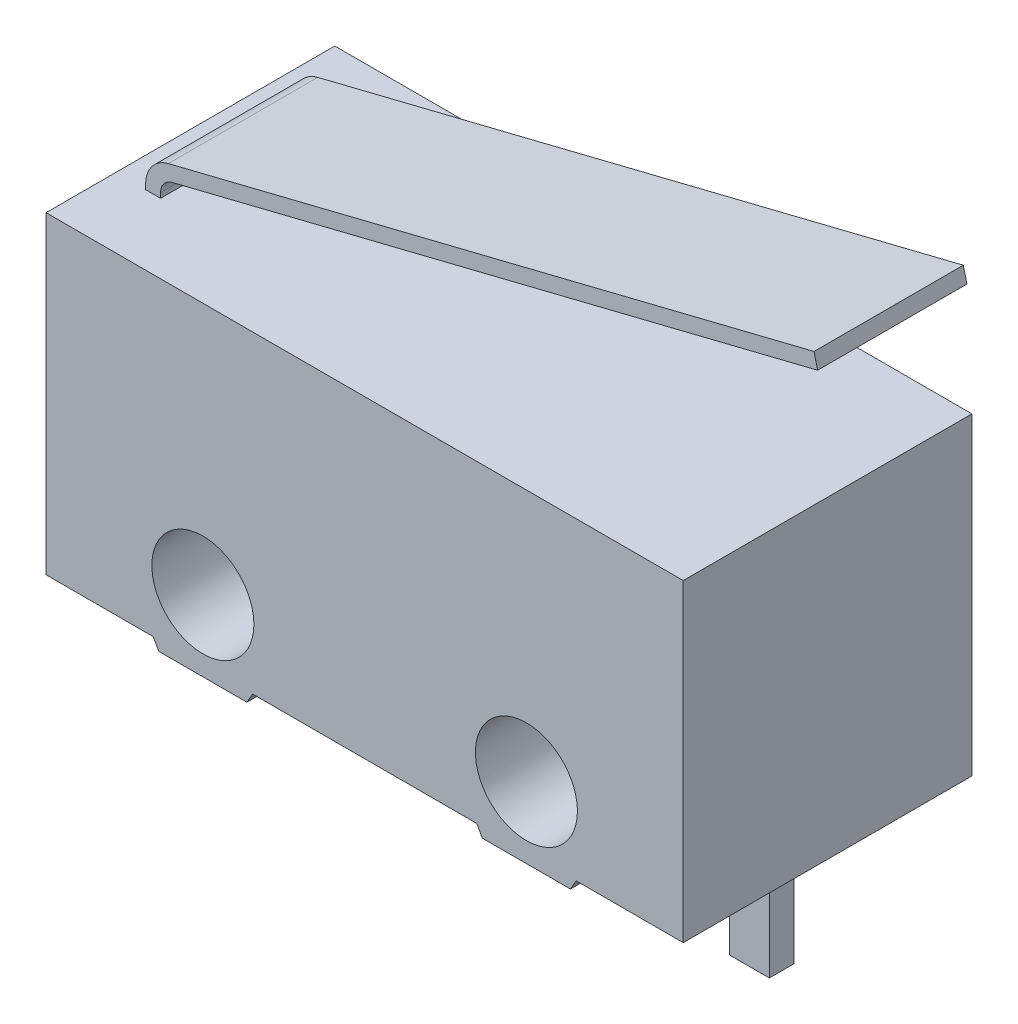
ISO-10303-21;
HEADER;
FILE_DESCRIPTION(('STEP AP214'),'2;1');
FILE_NAME('part.step','',(''),(''),'','','');
FILE_SCHEMA(('AUTOMOTIVE_DESIGN { 1 0 10303 214 1 1 1 1 }'));
ENDSEC;
DATA;
#1=APPLICATION_CONTEXT('core data for automotive mechanical design processes');
#2=APPLICATION_PROTOCOL_DEFINITION('international standard','automotive_design',2000,#1);
#3=PRODUCT_CONTEXT('',#1,'mechanical');
#4=PRODUCT('Part','Part','',(#3));
#5=PRODUCT_RELATED_PRODUCT_CATEGORY('part','',(#4));
#6=PRODUCT_DEFINITION_FORMATION('','',#4);
#7=PRODUCT_DEFINITION_CONTEXT('part definition',#1,'design');
#8=PRODUCT_DEFINITION('design','',#6,#7);
#9=PRODUCT_DEFINITION_SHAPE('','',#8);
#10=(LENGTH_UNIT() NAMED_UNIT(*) SI_UNIT(.MILLI.,.METRE.));
#11=(NAMED_UNIT(*) PLANE_ANGLE_UNIT() SI_UNIT($,.RADIAN.));
#12=(NAMED_UNIT(*) SI_UNIT($,.STERADIAN.) SOLID_ANGLE_UNIT());
#13=UNCERTAINTY_MEASURE_WITH_UNIT(LENGTH_MEASURE(1.E-05),#10,'distance_accuracy_value','');
#14=(GEOMETRIC_REPRESENTATION_CONTEXT(3) GLOBAL_UNCERTAINTY_ASSIGNED_CONTEXT((#13)) GLOBAL_UNIT_ASSIGNED_CONTEXT((#10,
#11,#12)) REPRESENTATION_CONTEXT('',''));
#15=CARTESIAN_POINT('',(0.,0.,0.));
#16=DIRECTION('',(0.,0.,1.));
#17=DIRECTION('',(1.,0.,0.));
#18=AXIS2_PLACEMENT_3D('',#15,#16,#17);
#19=CARTESIAN_POINT('',(-6.4,0.2,-2.9));
#20=DIRECTION('',(0.,1.,0.));
#21=DIRECTION('',(-1.,0.,0.));
#22=AXIS2_PLACEMENT_3D('',#19,#20,#21);
#23=PLANE('',#22);
#24=DIRECTION('',(-1.,0.,0.));
#25=VECTOR('',#24,1.);
#26=CARTESIAN_POINT('',(-6.4,0.2,2.9));
#27=LINE('',#26,#25);
#28=CARTESIAN_POINT('',(-4.25,0.2,2.9));
#29=VERTEX_POINT('',#28);
#30=CARTESIAN_POINT('',(-6.4,0.2,2.9));
#31=VERTEX_POINT('',#30);
#32=EDGE_CURVE('E499',#29,#31,#27,.T.);
#33=ORIENTED_EDGE('',*,*,#32,.T.);
#34=DIRECTION('',(0.,0.,1.));
#35=VECTOR('',#34,1.);
#36=CARTESIAN_POINT('',(-6.4,0.2,-2.9));
#37=LINE('',#36,#35);
#38=CARTESIAN_POINT('',(-6.4,0.2,-2.9));
#39=VERTEX_POINT('',#38);
#40=EDGE_CURVE('E509',#39,#31,#37,.T.);
#41=ORIENTED_EDGE('',*,*,#40,.F.);
#42=DIRECTION('',(-1.,0.,0.));
#43=VECTOR('',#42,1.);
#44=CARTESIAN_POINT('',(-6.4,0.2,-2.9));
#45=LINE('',#44,#43);
#46=CARTESIAN_POINT('',(-4.25,0.2,-2.9));
#47=VERTEX_POINT('',#46);
#48=EDGE_CURVE('E498',#47,#39,#45,.T.);
#49=ORIENTED_EDGE('',*,*,#48,.F.);
#50=DIRECTION('',(0.,0.,1.));
#51=VECTOR('',#50,1.);
#52=CARTESIAN_POINT('',(-4.25,0.2,-2.9));
#53=LINE('',#52,#51);
#54=EDGE_CURVE('E514',#47,#29,#53,.T.);
#55=ORIENTED_EDGE('',*,*,#54,.T.);
#56=EDGE_LOOP('',(#33,#41,#49,#55));
#57=FACE_BOUND('',#56,.T.);
#58=DIRECTION('',(0.,0.,-1.));
#59=VECTOR('',#58,1.);
#60=CARTESIAN_POINT('',(-5.48,0.199999999999999,0.25));
#61=LINE('',#60,#59);
#62=CARTESIAN_POINT('',(-5.48,0.199999999999999,0.25));
#63=VERTEX_POINT('',#62);
#64=CARTESIAN_POINT('',(-5.48,0.2,-0.25));
#65=VERTEX_POINT('',#64);
#66=EDGE_CURVE('E311',#63,#65,#61,.T.);
#67=ORIENTED_EDGE('',*,*,#66,.F.);
#68=DIRECTION('',(-1.,0.,0.));
#69=VECTOR('',#68,1.);
#70=CARTESIAN_POINT('',(-5.48,0.199999999999999,0.25));
#71=LINE('',#70,#69);
#72=CARTESIAN_POINT('',(-4.68,0.2,0.25));
#73=VERTEX_POINT('',#72);
#74=EDGE_CURVE('E300',#73,#63,#71,.T.);
#75=ORIENTED_EDGE('',*,*,#74,.F.);
#76=DIRECTION('',(0.,0.,1.));
#77=VECTOR('',#76,1.);
#78=CARTESIAN_POINT('',(-4.68,0.199999999999999,0.25));
#79=LINE('',#78,#77);
#80=CARTESIAN_POINT('',(-4.68,0.2,-0.25));
#81=VERTEX_POINT('',#80);
#82=EDGE_CURVE('E304',#81,#73,#79,.T.);
#83=ORIENTED_EDGE('',*,*,#82,.F.);
#84=DIRECTION('',(1.,0.,0.));
#85=VECTOR('',#84,1.);
#86=CARTESIAN_POINT('',(-5.48,0.199999999999999,-0.25));
#87=LINE('',#86,#85);
#88=EDGE_CURVE('E67',#65,#81,#87,.T.);
#89=ORIENTED_EDGE('',*,*,#88,.F.);
#90=EDGE_LOOP('',(#67,#75,#83,#89));
#91=FACE_BOUND('',#90,.T.);
#92=ADVANCED_FACE('F43',(#57,#91),#23,.F.);
#93=CARTESIAN_POINT('',(6.4,0.2,-2.9));
#94=DIRECTION('',(0.,1.,0.));
#95=DIRECTION('',(-1.,0.,0.));
#96=AXIS2_PLACEMENT_3D('',#93,#94,#95);
#97=PLANE('',#96);
#98=DIRECTION('',(-1.,0.,0.));
#99=VECTOR('',#98,1.);
#100=CARTESIAN_POINT('',(6.4,0.2,2.9));
#101=LINE('',#100,#99);
#102=CARTESIAN_POINT('',(6.4,0.2,2.9));
#103=VERTEX_POINT('',#102);
#104=CARTESIAN_POINT('',(4.25,0.2,2.9));
#105=VERTEX_POINT('',#104);
#106=EDGE_CURVE('E476',#103,#105,#101,.T.);
#107=ORIENTED_EDGE('',*,*,#106,.T.);
#108=DIRECTION('',(0.,0.,1.));
#109=VECTOR('',#108,1.);
#110=CARTESIAN_POINT('',(4.25,0.2,-2.9));
#111=LINE('',#110,#109);
#112=CARTESIAN_POINT('',(4.25,0.2,-2.9));
#113=VERTEX_POINT('',#112);
#114=EDGE_CURVE('E465',#113,#105,#111,.T.);
#115=ORIENTED_EDGE('',*,*,#114,.F.);
#116=DIRECTION('',(-1.,0.,0.));
#117=VECTOR('',#116,1.);
#118=CARTESIAN_POINT('',(6.4,0.2,-2.9));
#119=LINE('',#118,#117);
#120=CARTESIAN_POINT('',(6.4,0.2,-2.9));
#121=VERTEX_POINT('',#120);
#122=EDGE_CURVE('E477',#121,#113,#119,.T.);
#123=ORIENTED_EDGE('',*,*,#122,.F.);
#124=DIRECTION('',(0.,0.,1.));
#125=VECTOR('',#124,1.);
#126=CARTESIAN_POINT('',(6.4,0.2,-2.9));
#127=LINE('',#126,#125);
#128=EDGE_CURVE('E461',#121,#103,#127,.T.);
#129=ORIENTED_EDGE('',*,*,#128,.T.);
#130=EDGE_LOOP('',(#107,#115,#123,#129));
#131=FACE_BOUND('',#130,.T.);
#132=DIRECTION('',(0.,0.,-1.));
#133=VECTOR('',#132,1.);
#134=CARTESIAN_POINT('',(4.68,0.199999999999999,0.25));
#135=LINE('',#134,#133);
#136=CARTESIAN_POINT('',(4.68,0.199999999999999,0.25));
#137=VERTEX_POINT('',#136);
#138=CARTESIAN_POINT('',(4.68,0.2,-0.25));
#139=VERTEX_POINT('',#138);
#140=EDGE_CURVE('E356',#137,#139,#135,.T.);
#141=ORIENTED_EDGE('',*,*,#140,.F.);
#142=DIRECTION('',(-1.,0.,0.));
#143=VECTOR('',#142,1.);
#144=CARTESIAN_POINT('',(4.68,0.199999999999999,0.25));
#145=LINE('',#144,#143);
#146=CARTESIAN_POINT('',(5.48,0.2,0.25));
#147=VERTEX_POINT('',#146);
#148=EDGE_CURVE('E343',#147,#137,#145,.T.);
#149=ORIENTED_EDGE('',*,*,#148,.F.);
#150=DIRECTION('',(0.,0.,1.));
#151=VECTOR('',#150,1.);
#152=CARTESIAN_POINT('',(5.48,0.199999999999999,0.25));
#153=LINE('',#152,#151);
#154=CARTESIAN_POINT('',(5.48,0.2,-0.25));
#155=VERTEX_POINT('',#154);
#156=EDGE_CURVE('E347',#155,#147,#153,.T.);
#157=ORIENTED_EDGE('',*,*,#156,.F.);
#158=DIRECTION('',(1.,0.,0.));
#159=VECTOR('',#158,1.);
#160=CARTESIAN_POINT('',(4.68,0.199999999999999,-0.25));
#161=LINE('',#160,#159);
#162=EDGE_CURVE('E352',#139,#155,#161,.T.);
#163=ORIENTED_EDGE('',*,*,#162,.F.);
#164=EDGE_LOOP('',(#141,#149,#157,#163));
#165=FACE_BOUND('',#164,.T.);
#166=ADVANCED_FACE('F561',(#131,#165),#97,.F.);
#167=CARTESIAN_POINT('',(2.25,0.199999999999999,-2.9));
#168=DIRECTION('',(0.,1.,0.));
#169=DIRECTION('',(0.,0.,1.));
#170=AXIS2_PLACEMENT_3D('',#167,#168,#169);
#171=PLANE('',#170);
#172=DIRECTION('',(-1.,0.,0.));
#173=VECTOR('',#172,1.);
#174=CARTESIAN_POINT('',(2.25,0.199999999999999,2.9));
#175=LINE('',#174,#173);
#176=CARTESIAN_POINT('',(2.25,0.199999999999999,2.9));
#177=VERTEX_POINT('',#176);
#178=CARTESIAN_POINT('',(-2.25,0.199999999999999,2.9));
#179=VERTEX_POINT('',#178);
#180=EDGE_CURVE('E440',#177,#179,#175,.T.);
#181=ORIENTED_EDGE('',*,*,#180,.T.);
#182=DIRECTION('',(0.,0.,1.));
#183=VECTOR('',#182,1.);
#184=CARTESIAN_POINT('',(-2.25,0.199999999999999,-2.9));
#185=LINE('',#184,#183);
#186=CARTESIAN_POINT('',(-2.25,0.199999999999999,-2.9));
#187=VERTEX_POINT('',#186);
#188=EDGE_CURVE('E416',#187,#179,#185,.T.);
#189=ORIENTED_EDGE('',*,*,#188,.F.);
#190=DIRECTION('',(-1.,0.,0.));
#191=VECTOR('',#190,1.);
#192=CARTESIAN_POINT('',(2.25,0.199999999999999,-2.9));
#193=LINE('',#192,#191);
#194=CARTESIAN_POINT('',(2.25,0.199999999999999,-2.9));
#195=VERTEX_POINT('',#194);
#196=EDGE_CURVE('E431',#195,#187,#193,.T.);
#197=ORIENTED_EDGE('',*,*,#196,.F.);
#198=DIRECTION('',(0.,0.,1.));
#199=VECTOR('',#198,1.);
#200=CARTESIAN_POINT('',(2.25,0.199999999999999,-2.9));
#201=LINE('',#200,#199);
#202=EDGE_CURVE('E435',#195,#177,#201,.T.);
#203=ORIENTED_EDGE('',*,*,#202,.T.);
#204=EDGE_LOOP('',(#181,#189,#197,#203));
#205=FACE_BOUND('',#204,.T.);
#206=DIRECTION('',(0.,0.,-1.));
#207=VECTOR('',#206,1.);
#208=CARTESIAN_POINT('',(-0.4,0.199999999999999,0.25));
#209=LINE('',#208,#207);
#210=CARTESIAN_POINT('',(-0.4,0.199999999999999,0.25));
#211=VERTEX_POINT('',#210);
#212=CARTESIAN_POINT('',(-0.4,0.199999999999999,-0.25));
#213=VERTEX_POINT('',#212);
#214=EDGE_CURVE('E360',#211,#213,#209,.T.);
#215=ORIENTED_EDGE('',*,*,#214,.F.);
#216=DIRECTION('',(-1.,0.,0.));
#217=VECTOR('',#216,1.);
#218=CARTESIAN_POINT('',(-0.4,0.199999999999999,0.25));
#219=LINE('',#218,#217);
#220=CARTESIAN_POINT('',(0.4,0.199999999999999,0.25));
#221=VERTEX_POINT('',#220);
#222=EDGE_CURVE('E377',#221,#211,#219,.T.);
#223=ORIENTED_EDGE('',*,*,#222,.F.);
#224=DIRECTION('',(0.,0.,1.));
#225=VECTOR('',#224,1.);
#226=CARTESIAN_POINT('',(0.4,0.199999999999999,0.25));
#227=LINE('',#226,#225);
#228=CARTESIAN_POINT('',(0.4,0.199999999999999,-0.25));
#229=VERTEX_POINT('',#228);
#230=EDGE_CURVE('E394',#229,#221,#227,.T.);
#231=ORIENTED_EDGE('',*,*,#230,.F.);
#232=DIRECTION('',(1.,0.,0.));
#233=VECTOR('',#232,1.);
#234=CARTESIAN_POINT('',(-0.4,0.199999999999999,-0.25));
#235=LINE('',#234,#233);
#236=EDGE_CURVE('E390',#213,#229,#235,.T.);
#237=ORIENTED_EDGE('',*,*,#236,.F.);
#238=EDGE_LOOP('',(#215,#223,#231,#237));
#239=FACE_BOUND('',#238,.T.);
#240=ADVANCED_FACE('F601',(#205,#239),#171,.F.);
#241=CARTESIAN_POINT('',(0.,0.,0.));
#242=DIRECTION('',(0.,1.,0.));
#243=DIRECTION('',(0.,0.,1.));
#244=AXIS2_PLACEMENT_3D('',#241,#242,#243);
#245=PLANE('',#244);
#246=DIRECTION('',(-1.,0.,0.));
#247=VECTOR('',#246,1.);
#248=CARTESIAN_POINT('',(-6.4,0.,-2.9));
#249=LINE('',#248,#247);
#250=CARTESIAN_POINT('',(-2.36547005383792,0.,-2.9));
#251=VERTEX_POINT('',#250);
#252=CARTESIAN_POINT('',(-4.13452994616208,0.,-2.9));
#253=VERTEX_POINT('',#252);
#254=EDGE_CURVE('E538',#251,#253,#249,.T.);
#255=ORIENTED_EDGE('',*,*,#254,.F.);
#256=DIRECTION('',(0.,0.,1.));
#257=VECTOR('',#256,1.);
#258=CARTESIAN_POINT('',(-2.36547005383792,0.,-2.9));
#259=LINE('',#258,#257);
#260=CARTESIAN_POINT('',(-2.36547005383792,0.,2.9));
#261=VERTEX_POINT('',#260);
#262=EDGE_CURVE('E427',#251,#261,#259,.T.);
#263=ORIENTED_EDGE('',*,*,#262,.T.);
#264=DIRECTION('',(1.,0.,0.));
#265=VECTOR('',#264,1.);
#266=CARTESIAN_POINT('',(-6.4,0.,2.9));
#267=LINE('',#266,#265);
#268=CARTESIAN_POINT('',(-4.13452994616208,0.,2.9));
#269=VERTEX_POINT('',#268);
#270=EDGE_CURVE('E537',#269,#261,#267,.T.);
#271=ORIENTED_EDGE('',*,*,#270,.F.);
#272=DIRECTION('',(0.,0.,1.));
#273=VECTOR('',#272,1.);
#274=CARTESIAN_POINT('',(-4.13452994616208,0.,-2.9));
#275=LINE('',#274,#273);
#276=EDGE_CURVE('E503',#253,#269,#275,.T.);
#277=ORIENTED_EDGE('',*,*,#276,.F.);
#278=EDGE_LOOP('',(#255,#263,#271,#277));
#279=FACE_BOUND('',#278,.T.);
#280=ADVANCED_FACE('F584',(#279),#245,.F.);
#281=CARTESIAN_POINT('',(-6.4,6.5,-2.9));
#282=DIRECTION('',(1.,0.,0.));
#283=DIRECTION('',(0.,0.,-1.));
#284=AXIS2_PLACEMENT_3D('',#281,#282,#283);
#285=PLANE('',#284);
#286=DIRECTION('',(0.,-1.,0.));
#287=VECTOR('',#286,1.);
#288=CARTESIAN_POINT('',(-6.4,6.5,-2.9));
#289=LINE('',#288,#287);
#290=CARTESIAN_POINT('',(-6.4,6.5,-2.9));
#291=VERTEX_POINT('',#290);
#292=EDGE_CURVE('E533',#291,#39,#289,.T.);
#293=ORIENTED_EDGE('',*,*,#292,.T.);
#294=ORIENTED_EDGE('',*,*,#40,.T.);
#295=DIRECTION('',(0.,-1.,0.));
#296=VECTOR('',#295,1.);
#297=CARTESIAN_POINT('',(-6.4,6.5,2.9));
#298=LINE('',#297,#296);
#299=CARTESIAN_POINT('',(-6.4,6.5,2.9));
#300=VERTEX_POINT('',#299);
#301=EDGE_CURVE('E11',#300,#31,#298,.T.);
#302=ORIENTED_EDGE('',*,*,#301,.F.);
#303=DIRECTION('',(0.,0.,1.));
#304=VECTOR('',#303,1.);
#305=CARTESIAN_POINT('',(-6.4,6.5,-2.9));
#306=LINE('',#305,#304);
#307=EDGE_CURVE('E519',#291,#300,#306,.T.);
#308=ORIENTED_EDGE('',*,*,#307,.F.);
#309=EDGE_LOOP('',(#293,#294,#302,#308));
#310=FACE_BOUND('',#309,.T.);
#311=ADVANCED_FACE('F45',(#310),#285,.F.);
#312=CARTESIAN_POINT('',(-6.4,6.5,2.9));
#313=DIRECTION('',(0.,0.,-1.));
#314=DIRECTION('',(-1.,0.,0.));
#315=AXIS2_PLACEMENT_3D('',#312,#313,#314);
#316=PLANE('',#315);
#317=CARTESIAN_POINT('',(-3.25,1.425,2.9));
#318=DIRECTION('',(0.,0.,1.));
#319=DIRECTION('',(1.,0.,0.));
#320=AXIS2_PLACEMENT_3D('',#317,#318,#319);
#321=CIRCLE('',#320,1.025);
#322=CARTESIAN_POINT('',(-2.225,1.425,2.9));
#323=VERTEX_POINT('',#322);
#324=EDGE_CURVE('E472',#323,#323,#321,.T.);
#325=ORIENTED_EDGE('',*,*,#324,.F.);
#326=EDGE_LOOP('',(#325));
#327=FACE_BOUND('',#326,.T.);
#328=CARTESIAN_POINT('',(3.25,1.425,2.9));
#329=DIRECTION('',(0.,0.,1.));
#330=DIRECTION('',(1.,0.,0.));
#331=AXIS2_PLACEMENT_3D('',#328,#329,#330);
#332=CIRCLE('',#331,1.025);
#333=CARTESIAN_POINT('',(4.275,1.425,2.9));
#334=VERTEX_POINT('',#333);
#335=EDGE_CURVE('E417',#334,#334,#332,.T.);
#336=ORIENTED_EDGE('',*,*,#335,.F.);
#337=EDGE_LOOP('',(#336));
#338=FACE_BOUND('',#337,.T.);
#339=CARTESIAN_POINT('',(2.36547005383792,0.,2.9));
#340=VERTEX_POINT('',#339);
#341=CARTESIAN_POINT('',(4.13452994616208,0.,2.9));
#342=VERTEX_POINT('',#341);
#343=EDGE_CURVE('E513',#340,#342,#267,.T.);
#344=ORIENTED_EDGE('',*,*,#343,.T.);
#345=DIRECTION('',(-0.499999999999994,-0.866025403784442,0.));
#346=VECTOR('',#345,1.);
#347=CARTESIAN_POINT('',(4.25,0.2,2.9));
#348=LINE('',#347,#346);
#349=EDGE_CURVE('E473',#105,#342,#348,.T.);
#350=ORIENTED_EDGE('',*,*,#349,.F.);
#351=ORIENTED_EDGE('',*,*,#106,.F.);
#352=DIRECTION('',(0.,-1.,0.));
#353=VECTOR('',#352,1.);
#354=CARTESIAN_POINT('',(6.4,6.5,2.9));
#355=LINE('',#354,#353);
#356=CARTESIAN_POINT('',(6.4,6.5,2.9));
#357=VERTEX_POINT('',#356);
#358=EDGE_CURVE('E52',#357,#103,#355,.T.);
#359=ORIENTED_EDGE('',*,*,#358,.F.);
#360=DIRECTION('',(1.,0.,0.));
#361=VECTOR('',#360,1.);
#362=CARTESIAN_POINT('',(-6.4,6.5,2.9));
#363=LINE('',#362,#361);
#364=EDGE_CURVE('E523',#300,#357,#363,.T.);
#365=ORIENTED_EDGE('',*,*,#364,.F.);
#366=ORIENTED_EDGE('',*,*,#301,.T.);
#367=ORIENTED_EDGE('',*,*,#32,.F.);
#368=DIRECTION('',(-0.5,0.866025403784439,0.));
#369=VECTOR('',#368,1.);
#370=CARTESIAN_POINT('',(-4.25,0.2,2.9));
#371=LINE('',#370,#369);
#372=EDGE_CURVE('E481',#269,#29,#371,.T.);
#373=ORIENTED_EDGE('',*,*,#372,.F.);
#374=ORIENTED_EDGE('',*,*,#270,.T.);
#375=DIRECTION('',(-0.499999999999994,-0.866025403784442,0.));
#376=VECTOR('',#375,1.);
#377=CARTESIAN_POINT('',(-2.25,0.199999999999999,2.9));
#378=LINE('',#377,#376);
#379=EDGE_CURVE('E426',#179,#261,#378,.T.);
#380=ORIENTED_EDGE('',*,*,#379,.F.);
#381=ORIENTED_EDGE('',*,*,#180,.F.);
#382=DIRECTION('',(-0.499999999999994,0.866025403784442,0.));
#383=VECTOR('',#382,1.);
#384=CARTESIAN_POINT('',(2.36547005383792,0.,2.9));
#385=LINE('',#384,#383);
#386=EDGE_CURVE('E444',#340,#177,#385,.T.);
#387=ORIENTED_EDGE('',*,*,#386,.F.);
#388=EDGE_LOOP('',(#344,#350,#351,#359,#365,#366,#367,#373,#374,#380,#381,#387));
#389=FACE_BOUND('',#388,.T.);
#390=ADVANCED_FACE('F558',(#327,#338,#389),#316,.F.);
#391=CARTESIAN_POINT('',(6.4,6.5,-2.9));
#392=DIRECTION('',(-1.,0.,0.));
#393=DIRECTION('',(0.,0.,1.));
#394=AXIS2_PLACEMENT_3D('',#391,#392,#393);
#395=PLANE('',#394);
#396=ORIENTED_EDGE('',*,*,#358,.T.);
#397=ORIENTED_EDGE('',*,*,#128,.F.);
#398=DIRECTION('',(0.,-1.,0.));
#399=VECTOR('',#398,1.);
#400=CARTESIAN_POINT('',(6.4,6.5,-2.9));
#401=LINE('',#400,#399);
#402=CARTESIAN_POINT('',(6.4,6.5,-2.9));
#403=VERTEX_POINT('',#402);
#404=EDGE_CURVE('E545',#403,#121,#401,.T.);
#405=ORIENTED_EDGE('',*,*,#404,.F.);
#406=DIRECTION('',(0.,0.,-1.));
#407=VECTOR('',#406,1.);
#408=CARTESIAN_POINT('',(6.4,6.5,-2.9));
#409=LINE('',#408,#407);
#410=EDGE_CURVE('E527',#357,#403,#409,.T.);
#411=ORIENTED_EDGE('',*,*,#410,.F.);
#412=EDGE_LOOP('',(#396,#397,#405,#411));
#413=FACE_BOUND('',#412,.T.);
#414=ADVANCED_FACE('F554',(#413),#395,.F.);
#415=CARTESIAN_POINT('',(-6.4,6.5,-2.9));
#416=DIRECTION('',(0.,0.,1.));
#417=DIRECTION('',(1.,0.,0.));
#418=AXIS2_PLACEMENT_3D('',#415,#416,#417);
#419=PLANE('',#418);
#420=CARTESIAN_POINT('',(-3.25,1.425,-2.9));
#421=DIRECTION('',(0.,0.,1.));
#422=DIRECTION('',(1.,0.,0.));
#423=AXIS2_PLACEMENT_3D('',#420,#421,#422);
#424=CIRCLE('',#423,1.025);
#425=CARTESIAN_POINT('',(-2.225,1.425,-2.9));
#426=VERTEX_POINT('',#425);
#427=EDGE_CURVE('E421',#426,#426,#424,.T.);
#428=ORIENTED_EDGE('',*,*,#427,.T.);
#429=EDGE_LOOP('',(#428));
#430=FACE_BOUND('',#429,.T.);
#431=CARTESIAN_POINT('',(3.25,1.425,-2.9));
#432=DIRECTION('',(0.,0.,1.));
#433=DIRECTION('',(1.,0.,0.));
#434=AXIS2_PLACEMENT_3D('',#431,#432,#433);
#435=CIRCLE('',#434,1.025);
#436=CARTESIAN_POINT('',(4.275,1.425,-2.9));
#437=VERTEX_POINT('',#436);
#438=EDGE_CURVE('E422',#437,#437,#435,.T.);
#439=ORIENTED_EDGE('',*,*,#438,.T.);
#440=EDGE_LOOP('',(#439));
#441=FACE_BOUND('',#440,.T.);
#442=ORIENTED_EDGE('',*,*,#122,.T.);
#443=DIRECTION('',(-0.499999999999994,-0.866025403784442,0.));
#444=VECTOR('',#443,1.);
#445=CARTESIAN_POINT('',(4.25,0.2,-2.9));
#446=LINE('',#445,#444);
#447=CARTESIAN_POINT('',(4.13452994616208,0.,-2.9));
#448=VERTEX_POINT('',#447);
#449=EDGE_CURVE('E464',#113,#448,#446,.T.);
#450=ORIENTED_EDGE('',*,*,#449,.T.);
#451=CARTESIAN_POINT('',(2.36547005383792,0.,-2.9));
#452=VERTEX_POINT('',#451);
#453=EDGE_CURVE('E524',#448,#452,#249,.T.);
#454=ORIENTED_EDGE('',*,*,#453,.T.);
#455=DIRECTION('',(-0.499999999999994,0.866025403784442,0.));
#456=VECTOR('',#455,1.);
#457=CARTESIAN_POINT('',(2.36547005383792,0.,-2.9));
#458=LINE('',#457,#456);
#459=EDGE_CURVE('E454',#452,#195,#458,.T.);
#460=ORIENTED_EDGE('',*,*,#459,.T.);
#461=ORIENTED_EDGE('',*,*,#196,.T.);
#462=DIRECTION('',(-0.499999999999994,-0.866025403784442,0.));
#463=VECTOR('',#462,1.);
#464=CARTESIAN_POINT('',(-2.25,0.199999999999999,-2.9));
#465=LINE('',#464,#463);
#466=EDGE_CURVE('E445',#187,#251,#465,.T.);
#467=ORIENTED_EDGE('',*,*,#466,.T.);
#468=ORIENTED_EDGE('',*,*,#254,.T.);
#469=DIRECTION('',(-0.5,0.866025403784439,0.));
#470=VECTOR('',#469,1.);
#471=CARTESIAN_POINT('',(-4.25,0.2,-2.9));
#472=LINE('',#471,#470);
#473=EDGE_CURVE('E494',#253,#47,#472,.T.);
#474=ORIENTED_EDGE('',*,*,#473,.T.);
#475=ORIENTED_EDGE('',*,*,#48,.T.);
#476=ORIENTED_EDGE('',*,*,#292,.F.);
#477=DIRECTION('',(-1.,0.,0.));
#478=VECTOR('',#477,1.);
#479=CARTESIAN_POINT('',(-6.4,6.5,-2.9));
#480=LINE('',#479,#478);
#481=EDGE_CURVE('E530',#403,#291,#480,.T.);
#482=ORIENTED_EDGE('',*,*,#481,.F.);
#483=ORIENTED_EDGE('',*,*,#404,.T.);
#484=EDGE_LOOP('',(#442,#450,#454,#460,#461,#467,#468,#474,#475,#476,#482,#483));
#485=FACE_BOUND('',#484,.T.);
#486=ADVANCED_FACE('F565',(#430,#441,#485),#419,.F.);
#487=CARTESIAN_POINT('',(0.,6.5,0.));
#488=DIRECTION('',(0.,1.,0.));
#489=DIRECTION('',(0.,0.,1.));
#490=AXIS2_PLACEMENT_3D('',#487,#488,#489);
#491=PLANE('',#490);
#492=DIRECTION('',(1.,0.,0.));
#493=VECTOR('',#492,1.);
#494=CARTESIAN_POINT('',(-5.5,6.5,1.5));
#495=LINE('',#494,#493);
#496=CARTESIAN_POINT('',(-5.8,6.5,1.5));
#497=VERTEX_POINT('',#496);
#498=CARTESIAN_POINT('',(-5.5,6.5,1.5));
#499=VERTEX_POINT('',#498);
#500=EDGE_CURVE('E260',#497,#499,#495,.T.);
#501=ORIENTED_EDGE('',*,*,#500,.F.);
#502=DIRECTION('',(0.,0.,-1.));
#503=VECTOR('',#502,1.);
#504=CARTESIAN_POINT('',(-5.8,6.5,1.5));
#505=LINE('',#504,#503);
#506=CARTESIAN_POINT('',(-5.8,6.5,-1.5));
#507=VERTEX_POINT('',#506);
#508=EDGE_CURVE('E998',#497,#507,#505,.T.);
#509=ORIENTED_EDGE('',*,*,#508,.T.);
#510=DIRECTION('',(1.,0.,0.));
#511=VECTOR('',#510,1.);
#512=CARTESIAN_POINT('',(-5.5,6.5,-1.5));
#513=LINE('',#512,#511);
#514=CARTESIAN_POINT('',(-5.5,6.5,-1.5));
#515=VERTEX_POINT('',#514);
#516=EDGE_CURVE('E276',#507,#515,#513,.T.);
#517=ORIENTED_EDGE('',*,*,#516,.T.);
#518=DIRECTION('',(0.,0.,-1.));
#519=VECTOR('',#518,1.);
#520=CARTESIAN_POINT('',(-5.5,6.5,1.5));
#521=LINE('',#520,#519);
#522=EDGE_CURVE('E59',#499,#515,#521,.T.);
#523=ORIENTED_EDGE('',*,*,#522,.F.);
#524=EDGE_LOOP('',(#501,#509,#517,#523));
#525=FACE_BOUND('',#524,.T.);
#526=ORIENTED_EDGE('',*,*,#307,.T.);
#527=ORIENTED_EDGE('',*,*,#364,.T.);
#528=ORIENTED_EDGE('',*,*,#410,.T.);
#529=ORIENTED_EDGE('',*,*,#481,.T.);
#530=EDGE_LOOP('',(#526,#527,#528,#529));
#531=FACE_BOUND('',#530,.T.);
#532=ADVANCED_FACE('F273',(#525,#531),#491,.T.);
#533=ORIENTED_EDGE('',*,*,#453,.F.);
#534=DIRECTION('',(0.,0.,1.));
#535=VECTOR('',#534,1.);
#536=CARTESIAN_POINT('',(4.13452994616208,0.,-2.9));
#537=LINE('',#536,#535);
#538=EDGE_CURVE('E468',#448,#342,#537,.T.);
#539=ORIENTED_EDGE('',*,*,#538,.T.);
#540=ORIENTED_EDGE('',*,*,#343,.F.);
#541=DIRECTION('',(0.,0.,1.));
#542=VECTOR('',#541,1.);
#543=CARTESIAN_POINT('',(2.36547005383792,0.,-2.9));
#544=LINE('',#543,#542);
#545=EDGE_CURVE('E432',#452,#340,#544,.T.);
#546=ORIENTED_EDGE('',*,*,#545,.F.);
#547=EDGE_LOOP('',(#533,#539,#540,#546));
#548=FACE_BOUND('',#547,.T.);
#549=ADVANCED_FACE('F595',(#548),#245,.F.);
#550=CARTESIAN_POINT('',(-4.25,0.2,-2.9));
#551=DIRECTION('',(0.866025403784439,0.5,0.));
#552=DIRECTION('',(-0.5,0.866025403784439,0.));
#553=AXIS2_PLACEMENT_3D('',#550,#551,#552);
#554=PLANE('',#553);
#555=ORIENTED_EDGE('',*,*,#372,.T.);
#556=ORIENTED_EDGE('',*,*,#54,.F.);
#557=ORIENTED_EDGE('',*,*,#473,.F.);
#558=ORIENTED_EDGE('',*,*,#276,.T.);
#559=EDGE_LOOP('',(#555,#556,#557,#558));
#560=FACE_BOUND('',#559,.T.);
#561=ADVANCED_FACE('F580',(#560),#554,.F.);
#562=CARTESIAN_POINT('',(-2.25,0.199999999999999,-2.9));
#563=DIRECTION('',(-0.866025403784442,0.499999999999994,0.));
#564=DIRECTION('',(-0.499999999999994,-0.866025403784442,0.));
#565=AXIS2_PLACEMENT_3D('',#562,#563,#564);
#566=PLANE('',#565);
#567=ORIENTED_EDGE('',*,*,#379,.T.);
#568=ORIENTED_EDGE('',*,*,#262,.F.);
#569=ORIENTED_EDGE('',*,*,#466,.F.);
#570=ORIENTED_EDGE('',*,*,#188,.T.);
#571=EDGE_LOOP('',(#567,#568,#569,#570));
#572=FACE_BOUND('',#571,.T.);
#573=ADVANCED_FACE('F588',(#572),#566,.F.);
#574=CARTESIAN_POINT('',(2.36547005383792,0.,-2.9));
#575=DIRECTION('',(0.866025403784442,0.499999999999994,0.));
#576=DIRECTION('',(-0.499999999999994,0.866025403784442,0.));
#577=AXIS2_PLACEMENT_3D('',#574,#575,#576);
#578=PLANE('',#577);
#579=ORIENTED_EDGE('',*,*,#386,.T.);
#580=ORIENTED_EDGE('',*,*,#202,.F.);
#581=ORIENTED_EDGE('',*,*,#459,.F.);
#582=ORIENTED_EDGE('',*,*,#545,.T.);
#583=EDGE_LOOP('',(#579,#580,#581,#582));
#584=FACE_BOUND('',#583,.T.);
#585=ADVANCED_FACE('F599',(#584),#578,.F.);
#586=CARTESIAN_POINT('',(4.25,0.2,-2.9));
#587=DIRECTION('',(-0.866025403784442,0.499999999999994,0.));
#588=DIRECTION('',(-0.499999999999994,-0.866025403784442,0.));
#589=AXIS2_PLACEMENT_3D('',#586,#587,#588);
#590=PLANE('',#589);
#591=ORIENTED_EDGE('',*,*,#349,.T.);
#592=ORIENTED_EDGE('',*,*,#538,.F.);
#593=ORIENTED_EDGE('',*,*,#449,.F.);
#594=ORIENTED_EDGE('',*,*,#114,.T.);
#595=EDGE_LOOP('',(#591,#592,#593,#594));
#596=FACE_BOUND('',#595,.T.);
#597=ADVANCED_FACE('F661',(#596),#590,.F.);
#598=CARTESIAN_POINT('',(3.25,1.425,-2.9));
#599=DIRECTION('',(0.,0.,1.));
#600=DIRECTION('',(1.,0.,0.));
#601=AXIS2_PLACEMENT_3D('',#598,#599,#600);
#602=CYLINDRICAL_SURFACE('',#601,1.025);
#603=ORIENTED_EDGE('',*,*,#438,.F.);
#604=EDGE_LOOP('',(#603));
#605=FACE_BOUND('',#604,.T.);
#606=ORIENTED_EDGE('',*,*,#335,.T.);
#607=EDGE_LOOP('',(#606));
#608=FACE_BOUND('',#607,.T.);
#609=ADVANCED_FACE('F659',(#605,#608),#602,.F.);
#610=CARTESIAN_POINT('',(-3.25,1.425,-2.9));
#611=DIRECTION('',(0.,0.,1.));
#612=DIRECTION('',(1.,0.,0.));
#613=AXIS2_PLACEMENT_3D('',#610,#611,#612);
#614=CYLINDRICAL_SURFACE('',#613,1.025);
#615=ORIENTED_EDGE('',*,*,#427,.F.);
#616=EDGE_LOOP('',(#615));
#617=FACE_BOUND('',#616,.T.);
#618=ORIENTED_EDGE('',*,*,#324,.T.);
#619=EDGE_LOOP('',(#618));
#620=FACE_BOUND('',#619,.T.);
#621=ADVANCED_FACE('F629',(#617,#620),#614,.F.);
#622=CARTESIAN_POINT('',(-0.4,-2.2,0.25));
#623=DIRECTION('',(1.,0.,0.));
#624=DIRECTION('',(0.,0.,-1.));
#625=AXIS2_PLACEMENT_3D('',#622,#623,#624);
#626=PLANE('',#625);
#627=ORIENTED_EDGE('',*,*,#214,.T.);
#628=DIRECTION('',(0.,1.,0.));
#629=VECTOR('',#628,1.);
#630=CARTESIAN_POINT('',(-0.4,-2.2,-0.25));
#631=LINE('',#630,#629);
#632=CARTESIAN_POINT('',(-0.4,-2.2,-0.25));
#633=VERTEX_POINT('',#632);
#634=EDGE_CURVE('E412',#633,#213,#631,.T.);
#635=ORIENTED_EDGE('',*,*,#634,.F.);
#636=DIRECTION('',(0.,0.,-1.));
#637=VECTOR('',#636,1.);
#638=CARTESIAN_POINT('',(-0.4,-2.2,0.25));
#639=LINE('',#638,#637);
#640=CARTESIAN_POINT('',(-0.4,-2.2,0.25));
#641=VERTEX_POINT('',#640);
#642=EDGE_CURVE('E372',#641,#633,#639,.T.);
#643=ORIENTED_EDGE('',*,*,#642,.F.);
#644=DIRECTION('',(0.,1.,0.));
#645=VECTOR('',#644,1.);
#646=CARTESIAN_POINT('',(-0.4,-2.2,0.25));
#647=LINE('',#646,#645);
#648=EDGE_CURVE('E386',#641,#211,#647,.T.);
#649=ORIENTED_EDGE('',*,*,#648,.T.);
#650=EDGE_LOOP('',(#627,#635,#643,#649));
#651=FACE_BOUND('',#650,.T.);
#652=ADVANCED_FACE('F613',(#651),#626,.F.);
#653=CARTESIAN_POINT('',(-0.4,-2.2,-0.25));
#654=DIRECTION('',(0.,0.,1.));
#655=DIRECTION('',(1.,0.,0.));
#656=AXIS2_PLACEMENT_3D('',#653,#654,#655);
#657=PLANE('',#656);
#658=ORIENTED_EDGE('',*,*,#236,.T.);
#659=DIRECTION('',(0.,1.,0.));
#660=VECTOR('',#659,1.);
#661=CARTESIAN_POINT('',(0.4,-2.2,-0.25));
#662=LINE('',#661,#660);
#663=CARTESIAN_POINT('',(0.4,-2.2,-0.25));
#664=VERTEX_POINT('',#663);
#665=EDGE_CURVE('E408',#664,#229,#662,.T.);
#666=ORIENTED_EDGE('',*,*,#665,.F.);
#667=DIRECTION('',(1.,0.,0.));
#668=VECTOR('',#667,1.);
#669=CARTESIAN_POINT('',(-0.4,-2.2,-0.25));
#670=LINE('',#669,#668);
#671=EDGE_CURVE('E376',#633,#664,#670,.T.);
#672=ORIENTED_EDGE('',*,*,#671,.F.);
#673=ORIENTED_EDGE('',*,*,#634,.T.);
#674=EDGE_LOOP('',(#658,#666,#672,#673));
#675=FACE_BOUND('',#674,.T.);
#676=ADVANCED_FACE('F621',(#675),#657,.F.);
#677=CARTESIAN_POINT('',(0.4,-2.2,0.25));
#678=DIRECTION('',(-1.,0.,0.));
#679=DIRECTION('',(0.,0.,1.));
#680=AXIS2_PLACEMENT_3D('',#677,#678,#679);
#681=PLANE('',#680);
#682=ORIENTED_EDGE('',*,*,#230,.T.);
#683=DIRECTION('',(0.,1.,0.));
#684=VECTOR('',#683,1.);
#685=CARTESIAN_POINT('',(0.4,-2.2,0.25));
#686=LINE('',#685,#684);
#687=CARTESIAN_POINT('',(0.4,-2.2,0.25));
#688=VERTEX_POINT('',#687);
#689=EDGE_CURVE('E404',#688,#221,#686,.T.);
#690=ORIENTED_EDGE('',*,*,#689,.F.);
#691=DIRECTION('',(0.,0.,1.));
#692=VECTOR('',#691,1.);
#693=CARTESIAN_POINT('',(0.4,-2.2,0.25));
#694=LINE('',#693,#692);
#695=EDGE_CURVE('E380',#664,#688,#694,.T.);
#696=ORIENTED_EDGE('',*,*,#695,.F.);
#697=ORIENTED_EDGE('',*,*,#665,.T.);
#698=EDGE_LOOP('',(#682,#690,#696,#697));
#699=FACE_BOUND('',#698,.T.);
#700=ADVANCED_FACE('F619',(#699),#681,.F.);
#701=CARTESIAN_POINT('',(-0.4,-2.2,0.25));
#702=DIRECTION('',(0.,0.,-1.));
#703=DIRECTION('',(-1.,0.,0.));
#704=AXIS2_PLACEMENT_3D('',#701,#702,#703);
#705=PLANE('',#704);
#706=ORIENTED_EDGE('',*,*,#222,.T.);
#707=ORIENTED_EDGE('',*,*,#648,.F.);
#708=DIRECTION('',(-1.,0.,0.));
#709=VECTOR('',#708,1.);
#710=CARTESIAN_POINT('',(-0.4,-2.2,0.25));
#711=LINE('',#710,#709);
#712=EDGE_CURVE('E383',#688,#641,#711,.T.);
#713=ORIENTED_EDGE('',*,*,#712,.F.);
#714=ORIENTED_EDGE('',*,*,#689,.T.);
#715=EDGE_LOOP('',(#706,#707,#713,#714));
#716=FACE_BOUND('',#715,.T.);
#717=ADVANCED_FACE('F609',(#716),#705,.F.);
#718=CARTESIAN_POINT('',(0.,-2.2,0.));
#719=DIRECTION('',(0.,-1.,0.));
#720=DIRECTION('',(0.,0.,-1.));
#721=AXIS2_PLACEMENT_3D('',#718,#719,#720);
#722=PLANE('',#721);
#723=ORIENTED_EDGE('',*,*,#642,.T.);
#724=ORIENTED_EDGE('',*,*,#671,.T.);
#725=ORIENTED_EDGE('',*,*,#695,.T.);
#726=ORIENTED_EDGE('',*,*,#712,.T.);
#727=EDGE_LOOP('',(#723,#724,#725,#726));
#728=FACE_BOUND('',#727,.T.);
#729=ADVANCED_FACE('F615',(#728),#722,.T.);
#730=CARTESIAN_POINT('',(4.68,-2.2,0.25));
#731=DIRECTION('',(1.,0.,0.));
#732=DIRECTION('',(0.,0.,-1.));
#733=AXIS2_PLACEMENT_3D('',#730,#731,#732);
#734=PLANE('',#733);
#735=ORIENTED_EDGE('',*,*,#140,.T.);
#736=DIRECTION('',(0.,1.,0.));
#737=VECTOR('',#736,1.);
#738=CARTESIAN_POINT('',(4.68,-2.2,-0.25));
#739=LINE('',#738,#737);
#740=CARTESIAN_POINT('',(4.68,-2.2,-0.25));
#741=VERTEX_POINT('',#740);
#742=EDGE_CURVE('E315',#741,#139,#739,.T.);
#743=ORIENTED_EDGE('',*,*,#742,.F.);
#744=DIRECTION('',(0.,0.,-1.));
#745=VECTOR('',#744,1.);
#746=CARTESIAN_POINT('',(4.68,-2.2,0.25));
#747=LINE('',#746,#745);
#748=CARTESIAN_POINT('',(4.68,-2.2,0.25));
#749=VERTEX_POINT('',#748);
#750=EDGE_CURVE('E348',#749,#741,#747,.T.);
#751=ORIENTED_EDGE('',*,*,#750,.F.);
#752=DIRECTION('',(0.,1.,0.));
#753=VECTOR('',#752,1.);
#754=CARTESIAN_POINT('',(4.68,-2.2,0.25));
#755=LINE('',#754,#753);
#756=EDGE_CURVE('E338',#749,#137,#755,.T.);
#757=ORIENTED_EDGE('',*,*,#756,.T.);
#758=EDGE_LOOP('',(#735,#743,#751,#757));
#759=FACE_BOUND('',#758,.T.);
#760=ADVANCED_FACE('F750',(#759),#734,.F.);
#761=CARTESIAN_POINT('',(4.68,-2.2,-0.25));
#762=DIRECTION('',(0.,0.,1.));
#763=DIRECTION('',(1.,0.,0.));
#764=AXIS2_PLACEMENT_3D('',#761,#762,#763);
#765=PLANE('',#764);
#766=ORIENTED_EDGE('',*,*,#162,.T.);
#767=DIRECTION('',(0.,1.,0.));
#768=VECTOR('',#767,1.);
#769=CARTESIAN_POINT('',(5.48,-2.2,-0.25));
#770=LINE('',#769,#768);
#771=CARTESIAN_POINT('',(5.48,-2.2,-0.25));
#772=VERTEX_POINT('',#771);
#773=EDGE_CURVE('E330',#772,#155,#770,.T.);
#774=ORIENTED_EDGE('',*,*,#773,.F.);
#775=DIRECTION('',(1.,0.,0.));
#776=VECTOR('',#775,1.);
#777=CARTESIAN_POINT('',(4.68,-2.2,-0.25));
#778=LINE('',#777,#776);
#779=EDGE_CURVE('E366',#741,#772,#778,.T.);
#780=ORIENTED_EDGE('',*,*,#779,.F.);
#781=ORIENTED_EDGE('',*,*,#742,.T.);
#782=EDGE_LOOP('',(#766,#774,#780,#781));
#783=FACE_BOUND('',#782,.T.);
#784=ADVANCED_FACE('F760',(#783),#765,.F.);
#785=CARTESIAN_POINT('',(5.48,-2.2,0.25));
#786=DIRECTION('',(-1.,0.,0.));
#787=DIRECTION('',(0.,0.,1.));
#788=AXIS2_PLACEMENT_3D('',#785,#786,#787);
#789=PLANE('',#788);
#790=ORIENTED_EDGE('',*,*,#156,.T.);
#791=DIRECTION('',(0.,1.,0.));
#792=VECTOR('',#791,1.);
#793=CARTESIAN_POINT('',(5.48,-2.2,0.25));
#794=LINE('',#793,#792);
#795=CARTESIAN_POINT('',(5.48,-2.2,0.25));
#796=VERTEX_POINT('',#795);
#797=EDGE_CURVE('E334',#796,#147,#794,.T.);
#798=ORIENTED_EDGE('',*,*,#797,.F.);
#799=DIRECTION('',(0.,0.,1.));
#800=VECTOR('',#799,1.);
#801=CARTESIAN_POINT('',(5.48,-2.2,0.25));
#802=LINE('',#801,#800);
#803=EDGE_CURVE('E363',#772,#796,#802,.T.);
#804=ORIENTED_EDGE('',*,*,#803,.F.);
#805=ORIENTED_EDGE('',*,*,#773,.T.);
#806=EDGE_LOOP('',(#790,#798,#804,#805));
#807=FACE_BOUND('',#806,.T.);
#808=ADVANCED_FACE('F771',(#807),#789,.F.);
#809=CARTESIAN_POINT('',(4.68,-2.2,0.25));
#810=DIRECTION('',(0.,0.,-1.));
#811=DIRECTION('',(-1.,0.,0.));
#812=AXIS2_PLACEMENT_3D('',#809,#810,#811);
#813=PLANE('',#812);
#814=ORIENTED_EDGE('',*,*,#148,.T.);
#815=ORIENTED_EDGE('',*,*,#756,.F.);
#816=DIRECTION('',(-1.,0.,0.));
#817=VECTOR('',#816,1.);
#818=CARTESIAN_POINT('',(4.68,-2.2,0.25));
#819=LINE('',#818,#817);
#820=EDGE_CURVE('E342',#796,#749,#819,.T.);
#821=ORIENTED_EDGE('',*,*,#820,.F.);
#822=ORIENTED_EDGE('',*,*,#797,.T.);
#823=EDGE_LOOP('',(#814,#815,#821,#822));
#824=FACE_BOUND('',#823,.T.);
#825=ADVANCED_FACE('F782',(#824),#813,.F.);
#826=CARTESIAN_POINT('',(0.,-2.2,0.));
#827=DIRECTION('',(0.,-1.,0.));
#828=DIRECTION('',(0.,0.,-1.));
#829=AXIS2_PLACEMENT_3D('',#826,#827,#828);
#830=PLANE('',#829);
#831=ORIENTED_EDGE('',*,*,#750,.T.);
#832=ORIENTED_EDGE('',*,*,#779,.T.);
#833=ORIENTED_EDGE('',*,*,#803,.T.);
#834=ORIENTED_EDGE('',*,*,#820,.T.);
#835=EDGE_LOOP('',(#831,#832,#833,#834));
#836=FACE_BOUND('',#835,.T.);
#837=ADVANCED_FACE('F793',(#836),#830,.T.);
#838=CARTESIAN_POINT('',(-5.48,-2.2,0.25));
#839=DIRECTION('',(1.,0.,0.));
#840=DIRECTION('',(0.,0.,-1.));
#841=AXIS2_PLACEMENT_3D('',#838,#839,#840);
#842=PLANE('',#841);
#843=ORIENTED_EDGE('',*,*,#66,.T.);
#844=DIRECTION('',(0.,1.,0.));
#845=VECTOR('',#844,1.);
#846=CARTESIAN_POINT('',(-5.48,-2.2,-0.25));
#847=LINE('',#846,#845);
#848=CARTESIAN_POINT('',(-5.48,-2.2,-0.25));
#849=VERTEX_POINT('',#848);
#850=EDGE_CURVE('E278',#849,#65,#847,.T.);
#851=ORIENTED_EDGE('',*,*,#850,.F.);
#852=DIRECTION('',(0.,0.,-1.));
#853=VECTOR('',#852,1.);
#854=CARTESIAN_POINT('',(-5.48,-2.2,0.25));
#855=LINE('',#854,#853);
#856=CARTESIAN_POINT('',(-5.48,-2.2,0.25));
#857=VERTEX_POINT('',#856);
#858=EDGE_CURVE('E305',#857,#849,#855,.T.);
#859=ORIENTED_EDGE('',*,*,#858,.F.);
#860=DIRECTION('',(0.,1.,0.));
#861=VECTOR('',#860,1.);
#862=CARTESIAN_POINT('',(-5.48,-2.2,0.25));
#863=LINE('',#862,#861);
#864=EDGE_CURVE('E295',#857,#63,#863,.T.);
#865=ORIENTED_EDGE('',*,*,#864,.T.);
#866=EDGE_LOOP('',(#843,#851,#859,#865));
#867=FACE_BOUND('',#866,.T.);
#868=ADVANCED_FACE('F804',(#867),#842,.F.);
#869=CARTESIAN_POINT('',(-5.48,-2.2,-0.25));
#870=DIRECTION('',(0.,0.,1.));
#871=DIRECTION('',(1.,0.,0.));
#872=AXIS2_PLACEMENT_3D('',#869,#870,#871);
#873=PLANE('',#872);
#874=ORIENTED_EDGE('',*,*,#88,.T.);
#875=DIRECTION('',(0.,1.,0.));
#876=VECTOR('',#875,1.);
#877=CARTESIAN_POINT('',(-4.68,-2.2,-0.25));
#878=LINE('',#877,#876);
#879=CARTESIAN_POINT('',(-4.68,-2.2,-0.25));
#880=VERTEX_POINT('',#879);
#881=EDGE_CURVE('E282',#880,#81,#878,.T.);
#882=ORIENTED_EDGE('',*,*,#881,.F.);
#883=DIRECTION('',(1.,0.,0.));
#884=VECTOR('',#883,1.);
#885=CARTESIAN_POINT('',(-5.48,-2.2,-0.25));
#886=LINE('',#885,#884);
#887=EDGE_CURVE('E321',#849,#880,#886,.T.);
#888=ORIENTED_EDGE('',*,*,#887,.F.);
#889=ORIENTED_EDGE('',*,*,#850,.T.);
#890=EDGE_LOOP('',(#874,#882,#888,#889));
#891=FACE_BOUND('',#890,.T.);
#892=ADVANCED_FACE('F815',(#891),#873,.F.);
#893=CARTESIAN_POINT('',(-4.68,-2.2,0.25));
#894=DIRECTION('',(-1.,0.,0.));
#895=DIRECTION('',(0.,0.,1.));
#896=AXIS2_PLACEMENT_3D('',#893,#894,#895);
#897=PLANE('',#896);
#898=ORIENTED_EDGE('',*,*,#82,.T.);
#899=DIRECTION('',(0.,1.,0.));
#900=VECTOR('',#899,1.);
#901=CARTESIAN_POINT('',(-4.68,-2.2,0.25));
#902=LINE('',#901,#900);
#903=CARTESIAN_POINT('',(-4.68,-2.2,0.25));
#904=VERTEX_POINT('',#903);
#905=EDGE_CURVE('E291',#904,#73,#902,.T.);
#906=ORIENTED_EDGE('',*,*,#905,.F.);
#907=DIRECTION('',(0.,0.,1.));
#908=VECTOR('',#907,1.);
#909=CARTESIAN_POINT('',(-4.68,-2.2,0.25));
#910=LINE('',#909,#908);
#911=EDGE_CURVE('E318',#880,#904,#910,.T.);
#912=ORIENTED_EDGE('',*,*,#911,.F.);
#913=ORIENTED_EDGE('',*,*,#881,.T.);
#914=EDGE_LOOP('',(#898,#906,#912,#913));
#915=FACE_BOUND('',#914,.T.);
#916=ADVANCED_FACE('F826',(#915),#897,.F.);
#917=CARTESIAN_POINT('',(-5.48,-2.2,0.25));
#918=DIRECTION('',(0.,0.,-1.));
#919=DIRECTION('',(-1.,0.,0.));
#920=AXIS2_PLACEMENT_3D('',#917,#918,#919);
#921=PLANE('',#920);
#922=ORIENTED_EDGE('',*,*,#74,.T.);
#923=ORIENTED_EDGE('',*,*,#864,.F.);
#924=DIRECTION('',(-1.,0.,0.));
#925=VECTOR('',#924,1.);
#926=CARTESIAN_POINT('',(-5.48,-2.2,0.25));
#927=LINE('',#926,#925);
#928=EDGE_CURVE('E299',#904,#857,#927,.T.);
#929=ORIENTED_EDGE('',*,*,#928,.F.);
#930=ORIENTED_EDGE('',*,*,#905,.T.);
#931=EDGE_LOOP('',(#922,#923,#929,#930));
#932=FACE_BOUND('',#931,.T.);
#933=ADVANCED_FACE('F837',(#932),#921,.F.);
#934=CARTESIAN_POINT('',(0.,-2.2,0.));
#935=DIRECTION('',(0.,-1.,0.));
#936=DIRECTION('',(0.,0.,-1.));
#937=AXIS2_PLACEMENT_3D('',#934,#935,#936);
#938=PLANE('',#937);
#939=ORIENTED_EDGE('',*,*,#858,.T.);
#940=ORIENTED_EDGE('',*,*,#887,.T.);
#941=ORIENTED_EDGE('',*,*,#911,.T.);
#942=ORIENTED_EDGE('',*,*,#928,.T.);
#943=EDGE_LOOP('',(#939,#940,#941,#942));
#944=FACE_BOUND('',#943,.T.);
#945=ADVANCED_FACE('F848',(#944),#938,.T.);
#946=CARTESIAN_POINT('',(-5.5,6.6,1.5));
#947=DIRECTION('',(-1.,0.,0.));
#948=DIRECTION('',(0.,0.,1.));
#949=AXIS2_PLACEMENT_3D('',#946,#947,#948);
#950=PLANE('',#949);
#951=DIRECTION('',(0.,1.,0.));
#952=VECTOR('',#951,1.);
#953=CARTESIAN_POINT('',(-5.5,6.6,-1.5));
#954=LINE('',#953,#952);
#955=CARTESIAN_POINT('',(-5.5,6.6,-1.5));
#956=VERTEX_POINT('',#955);
#957=EDGE_CURVE('E995',#515,#956,#954,.T.);
#958=ORIENTED_EDGE('',*,*,#957,.T.);
#959=DIRECTION('',(0.,0.,-1.));
#960=VECTOR('',#959,1.);
#961=CARTESIAN_POINT('',(-5.5,6.6,1.5));
#962=LINE('',#961,#960);
#963=CARTESIAN_POINT('',(-5.5,6.6,1.5));
#964=VERTEX_POINT('',#963);
#965=EDGE_CURVE('E255',#964,#956,#962,.T.);
#966=ORIENTED_EDGE('',*,*,#965,.F.);
#967=DIRECTION('',(0.,1.,0.));
#968=VECTOR('',#967,1.);
#969=CARTESIAN_POINT('',(-5.5,6.6,1.5));
#970=LINE('',#969,#968);
#971=EDGE_CURVE('E251',#499,#964,#970,.T.);
#972=ORIENTED_EDGE('',*,*,#971,.F.);
#973=ORIENTED_EDGE('',*,*,#522,.T.);
#974=EDGE_LOOP('',(#958,#966,#972,#973));
#975=FACE_BOUND('',#974,.T.);
#976=ADVANCED_FACE('F253',(#975),#950,.F.);
#977=CARTESIAN_POINT('',(-5.2,6.6,1.5));
#978=DIRECTION('',(0.,0.,-1.));
#979=DIRECTION('',(-1.,0.,0.));
#980=AXIS2_PLACEMENT_3D('',#977,#978,#979);
#981=CYLINDRICAL_SURFACE('',#980,0.299999999999999);
#982=CARTESIAN_POINT('',(-5.2,6.6,-1.5));
#983=DIRECTION('',(0.,0.,-1.));
#984=DIRECTION('',(1.,0.,0.));
#985=AXIS2_PLACEMENT_3D('',#982,#983,#984);
#986=CIRCLE('',#985,0.299999999999999);
#987=CARTESIAN_POINT('',(-5.27222378190561,6.89117645050253,-1.5));
#988=VERTEX_POINT('',#987);
#989=EDGE_CURVE('E1031',#956,#988,#986,.T.);
#990=ORIENTED_EDGE('',*,*,#989,.T.);
#991=DIRECTION('',(0.,0.,-1.));
#992=VECTOR('',#991,1.);
#993=CARTESIAN_POINT('',(-5.27222378190561,6.89117645050253,1.5));
#994=LINE('',#993,#992);
#995=CARTESIAN_POINT('',(-5.27222378190561,6.89117645050253,1.5));
#996=VERTEX_POINT('',#995);
#997=EDGE_CURVE('E284',#996,#988,#994,.T.);
#998=ORIENTED_EDGE('',*,*,#997,.F.);
#999=CARTESIAN_POINT('',(-5.2,6.6,1.5));
#1000=DIRECTION('',(0.,0.,-1.));
#1001=DIRECTION('',(1.,0.,0.));
#1002=AXIS2_PLACEMENT_3D('',#999,#1000,#1001);
#1003=CIRCLE('',#1002,0.299999999999999);
#1004=EDGE_CURVE('E259',#964,#996,#1003,.T.);
#1005=ORIENTED_EDGE('',*,*,#1004,.F.);
#1006=ORIENTED_EDGE('',*,*,#965,.T.);
#1007=EDGE_LOOP('',(#990,#998,#1005,#1006));
#1008=FACE_BOUND('',#1007,.T.);
#1009=ADVANCED_FACE('F878',(#1008),#981,.F.);
#1010=CARTESIAN_POINT('',(7.7,10.1088235494975,1.5));
#1011=DIRECTION('',(-0.240745939685363,0.970588168341759,0.));
#1012=DIRECTION('',(-0.97058816834176,-0.240745939685363,0.));
#1013=AXIS2_PLACEMENT_3D('',#1010,#1011,#1012);
#1014=PLANE('',#1013);
#1015=DIRECTION('',(0.970588168341759,0.240745939685363,0.));
#1016=VECTOR('',#1015,1.);
#1017=CARTESIAN_POINT('',(7.7,10.1088235494975,-1.5));
#1018=LINE('',#1017,#1016);
#1019=CARTESIAN_POINT('',(7.7,10.1088235494975,-1.5));
#1020=VERTEX_POINT('',#1019);
#1021=EDGE_CURVE('E1028',#988,#1020,#1018,.T.);
#1022=ORIENTED_EDGE('',*,*,#1021,.T.);
#1023=DIRECTION('',(0.,0.,-1.));
#1024=VECTOR('',#1023,1.);
#1025=CARTESIAN_POINT('',(7.7,10.1088235494975,1.5));
#1026=LINE('',#1025,#1024);
#1027=CARTESIAN_POINT('',(7.7,10.1088235494975,1.5));
#1028=VERTEX_POINT('',#1027);
#1029=EDGE_CURVE('E1019',#1028,#1020,#1026,.T.);
#1030=ORIENTED_EDGE('',*,*,#1029,.F.);
#1031=DIRECTION('',(0.970588168341759,0.240745939685363,0.));
#1032=VECTOR('',#1031,1.);
#1033=CARTESIAN_POINT('',(7.7,10.1088235494975,1.5));
#1034=LINE('',#1033,#1032);
#1035=EDGE_CURVE('E1029',#996,#1028,#1034,.T.);
#1036=ORIENTED_EDGE('',*,*,#1035,.F.);
#1037=ORIENTED_EDGE('',*,*,#997,.T.);
#1038=EDGE_LOOP('',(#1022,#1030,#1036,#1037));
#1039=FACE_BOUND('',#1038,.T.);
#1040=ADVANCED_FACE('F888',(#1039),#1014,.F.);
#1041=CARTESIAN_POINT('',(7.62777621809439,10.4,1.5));
#1042=DIRECTION('',(-0.97058816834176,-0.240745939685362,0.));
#1043=DIRECTION('',(0.240745939685362,-0.97058816834176,0.));
#1044=AXIS2_PLACEMENT_3D('',#1041,#1042,#1043);
#1045=PLANE('',#1044);
#1046=DIRECTION('',(-0.240745939685362,0.97058816834176,0.));
#1047=VECTOR('',#1046,1.);
#1048=CARTESIAN_POINT('',(7.62777621809439,10.4,-1.5));
#1049=LINE('',#1048,#1047);
#1050=CARTESIAN_POINT('',(7.62777621809439,10.4,-1.5));
#1051=VERTEX_POINT('',#1050);
#1052=EDGE_CURVE('E1033',#1020,#1051,#1049,.T.);
#1053=ORIENTED_EDGE('',*,*,#1052,.T.);
#1054=DIRECTION('',(0.,0.,-1.));
#1055=VECTOR('',#1054,1.);
#1056=CARTESIAN_POINT('',(7.62777621809439,10.4,1.5));
#1057=LINE('',#1056,#1055);
#1058=CARTESIAN_POINT('',(7.62777621809439,10.4,1.5));
#1059=VERTEX_POINT('',#1058);
#1060=EDGE_CURVE('E1015',#1059,#1051,#1057,.T.);
#1061=ORIENTED_EDGE('',*,*,#1060,.F.);
#1062=DIRECTION('',(-0.240745939685362,0.97058816834176,0.));
#1063=VECTOR('',#1062,1.);
#1064=CARTESIAN_POINT('',(7.62777621809439,10.4,1.5));
#1065=LINE('',#1064,#1063);
#1066=EDGE_CURVE('E1054',#1028,#1059,#1065,.T.);
#1067=ORIENTED_EDGE('',*,*,#1066,.F.);
#1068=ORIENTED_EDGE('',*,*,#1029,.T.);
#1069=EDGE_LOOP('',(#1053,#1061,#1067,#1068));
#1070=FACE_BOUND('',#1069,.T.);
#1071=ADVANCED_FACE('F899',(#1070),#1045,.F.);
#1072=CARTESIAN_POINT('',(-5.34444756381122,7.18235290100506,1.5));
#1073=DIRECTION('',(0.240745939685363,-0.970588168341759,0.));
#1074=DIRECTION('',(0.97058816834176,0.240745939685363,0.));
#1075=AXIS2_PLACEMENT_3D('',#1072,#1073,#1074);
#1076=PLANE('',#1075);
#1077=DIRECTION('',(-0.970588168341759,-0.240745939685363,0.));
#1078=VECTOR('',#1077,1.);
#1079=CARTESIAN_POINT('',(-5.34444756381122,7.18235290100506,-1.5));
#1080=LINE('',#1079,#1078);
#1081=CARTESIAN_POINT('',(-5.34444756381122,7.18235290100505,-1.5));
#1082=VERTEX_POINT('',#1081);
#1083=EDGE_CURVE('E1038',#1051,#1082,#1080,.T.);
#1084=ORIENTED_EDGE('',*,*,#1083,.T.);
#1085=DIRECTION('',(0.,0.,-1.));
#1086=VECTOR('',#1085,1.);
#1087=CARTESIAN_POINT('',(-5.34444756381122,7.18235290100505,1.5));
#1088=LINE('',#1087,#1086);
#1089=CARTESIAN_POINT('',(-5.34444756381122,7.18235290100505,1.5));
#1090=VERTEX_POINT('',#1089);
#1091=EDGE_CURVE('E1005',#1090,#1082,#1088,.T.);
#1092=ORIENTED_EDGE('',*,*,#1091,.F.);
#1093=DIRECTION('',(-0.970588168341759,-0.240745939685363,0.));
#1094=VECTOR('',#1093,1.);
#1095=CARTESIAN_POINT('',(-5.34444756381122,7.18235290100506,1.5));
#1096=LINE('',#1095,#1094);
#1097=EDGE_CURVE('E1051',#1059,#1090,#1096,.T.);
#1098=ORIENTED_EDGE('',*,*,#1097,.F.);
#1099=ORIENTED_EDGE('',*,*,#1060,.T.);
#1100=EDGE_LOOP('',(#1084,#1092,#1098,#1099));
#1101=FACE_BOUND('',#1100,.T.);
#1102=ADVANCED_FACE('F910',(#1101),#1076,.F.);
#1103=CARTESIAN_POINT('',(-5.2,6.6,1.5));
#1104=DIRECTION('',(0.,0.,-1.));
#1105=DIRECTION('',(-1.,0.,0.));
#1106=AXIS2_PLACEMENT_3D('',#1103,#1104,#1105);
#1107=CYLINDRICAL_SURFACE('',#1106,0.599999999999999);
#1108=CARTESIAN_POINT('',(-5.2,6.6,-1.5));
#1109=DIRECTION('',(0.,0.,1.));
#1110=DIRECTION('',(1.,0.,0.));
#1111=AXIS2_PLACEMENT_3D('',#1108,#1109,#1110);
#1112=CIRCLE('',#1111,0.599999999999999);
#1113=CARTESIAN_POINT('',(-5.8,6.6,-1.5));
#1114=VERTEX_POINT('',#1113);
#1115=EDGE_CURVE('E1044',#1082,#1114,#1112,.T.);
#1116=ORIENTED_EDGE('',*,*,#1115,.T.);
#1117=DIRECTION('',(0.,0.,-1.));
#1118=VECTOR('',#1117,1.);
#1119=CARTESIAN_POINT('',(-5.8,6.6,1.5));
#1120=LINE('',#1119,#1118);
#1121=CARTESIAN_POINT('',(-5.8,6.6,1.5));
#1122=VERTEX_POINT('',#1121);
#1123=EDGE_CURVE('E1000',#1122,#1114,#1120,.T.);
#1124=ORIENTED_EDGE('',*,*,#1123,.F.);
#1125=CARTESIAN_POINT('',(-5.2,6.6,1.5));
#1126=DIRECTION('',(0.,0.,1.));
#1127=DIRECTION('',(1.,0.,0.));
#1128=AXIS2_PLACEMENT_3D('',#1125,#1126,#1127);
#1129=CIRCLE('',#1128,0.599999999999999);
#1130=EDGE_CURVE('E1007',#1090,#1122,#1129,.T.);
#1131=ORIENTED_EDGE('',*,*,#1130,.F.);
#1132=ORIENTED_EDGE('',*,*,#1091,.T.);
#1133=EDGE_LOOP('',(#1116,#1124,#1131,#1132));
#1134=FACE_BOUND('',#1133,.T.);
#1135=ADVANCED_FACE('F921',(#1134),#1107,.T.);
#1136=CARTESIAN_POINT('',(-5.8,6.5,1.5));
#1137=DIRECTION('',(1.,0.,0.));
#1138=DIRECTION('',(0.,1.,0.));
#1139=AXIS2_PLACEMENT_3D('',#1136,#1137,#1138);
#1140=PLANE('',#1139);
#1141=DIRECTION('',(0.,-1.,0.));
#1142=VECTOR('',#1141,1.);
#1143=CARTESIAN_POINT('',(-5.8,6.5,-1.5));
#1144=LINE('',#1143,#1142);
#1145=EDGE_CURVE('E270',#1114,#507,#1144,.T.);
#1146=ORIENTED_EDGE('',*,*,#1145,.T.);
#1147=ORIENTED_EDGE('',*,*,#508,.F.);
#1148=DIRECTION('',(0.,-1.,0.));
#1149=VECTOR('',#1148,1.);
#1150=CARTESIAN_POINT('',(-5.8,6.5,1.5));
#1151=LINE('',#1150,#1149);
#1152=EDGE_CURVE('E265',#1122,#497,#1151,.T.);
#1153=ORIENTED_EDGE('',*,*,#1152,.F.);
#1154=ORIENTED_EDGE('',*,*,#1123,.T.);
#1155=EDGE_LOOP('',(#1146,#1147,#1153,#1154));
#1156=FACE_BOUND('',#1155,.T.);
#1157=ADVANCED_FACE('F932',(#1156),#1140,.F.);
#1158=CARTESIAN_POINT('',(-5.2,6.6,1.5));
#1159=DIRECTION('',(0.,0.,1.));
#1160=DIRECTION('',(1.,0.,0.));
#1161=AXIS2_PLACEMENT_3D('',#1158,#1159,#1160);
#1162=PLANE('',#1161);
#1163=ORIENTED_EDGE('',*,*,#500,.T.);
#1164=ORIENTED_EDGE('',*,*,#971,.T.);
#1165=ORIENTED_EDGE('',*,*,#1004,.T.);
#1166=ORIENTED_EDGE('',*,*,#1035,.T.);
#1167=ORIENTED_EDGE('',*,*,#1066,.T.);
#1168=ORIENTED_EDGE('',*,*,#1097,.T.);
#1169=ORIENTED_EDGE('',*,*,#1130,.T.);
#1170=ORIENTED_EDGE('',*,*,#1152,.T.);
#1171=EDGE_LOOP('',(#1163,#1164,#1165,#1166,#1167,#1168,#1169,#1170));
#1172=FACE_BOUND('',#1171,.T.);
#1173=ADVANCED_FACE('F263',(#1172),#1162,.T.);
#1174=CARTESIAN_POINT('',(-5.2,6.6,-1.5));
#1175=DIRECTION('',(0.,0.,1.));
#1176=DIRECTION('',(1.,0.,0.));
#1177=AXIS2_PLACEMENT_3D('',#1174,#1175,#1176);
#1178=PLANE('',#1177);
#1179=ORIENTED_EDGE('',*,*,#516,.F.);
#1180=ORIENTED_EDGE('',*,*,#1145,.F.);
#1181=ORIENTED_EDGE('',*,*,#1115,.F.);
#1182=ORIENTED_EDGE('',*,*,#1083,.F.);
#1183=ORIENTED_EDGE('',*,*,#1052,.F.);
#1184=ORIENTED_EDGE('',*,*,#1021,.F.);
#1185=ORIENTED_EDGE('',*,*,#989,.F.);
#1186=ORIENTED_EDGE('',*,*,#957,.F.);
#1187=EDGE_LOOP('',(#1179,#1180,#1181,#1182,#1183,#1184,#1185,#1186));
#1188=FACE_BOUND('',#1187,.T.);
#1189=ADVANCED_FACE('F953',(#1188),#1178,.F.);
#1190=CLOSED_SHELL('',(#92,#166,#240,#280,#311,#390,#414,#486,#532,#549,#561,#573,#585,#597,
#609,#621,#652,#676,#700,#717,#729,#760,#784,#808,#825,#837,#868,#892,#916,#933,#945,#976,#1009,
#1040,#1071,#1102,#1135,#1157,#1173,#1189));
#1191=MANIFOLD_SOLID_BREP('B2',#1190);
#1192=ADVANCED_BREP_SHAPE_REPRESENTATION('',(#18,#1191),#14);
#1193=SHAPE_DEFINITION_REPRESENTATION(#9,#1192);
ENDSEC;
END-ISO-10303-21;
